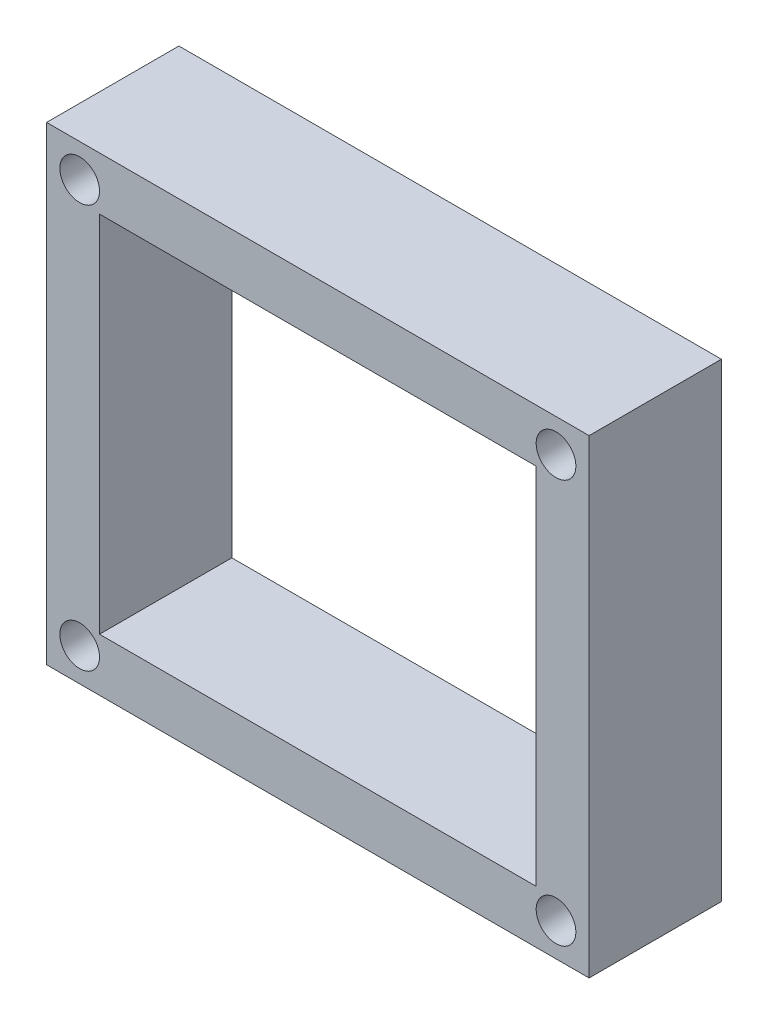
ISO-10303-21;
HEADER;
FILE_DESCRIPTION(('STEP AP214'),'2;1');
FILE_NAME('part.step','',(''),(''),'','','');
FILE_SCHEMA(('AUTOMOTIVE_DESIGN { 1 0 10303 214 1 1 1 1 }'));
ENDSEC;
DATA;
#1=APPLICATION_CONTEXT('core data for automotive mechanical design processes');
#2=APPLICATION_PROTOCOL_DEFINITION('international standard','automotive_design',2000,#1);
#3=PRODUCT_CONTEXT('',#1,'mechanical');
#4=PRODUCT('Part','Part','',(#3));
#5=PRODUCT_RELATED_PRODUCT_CATEGORY('part','',(#4));
#6=PRODUCT_DEFINITION_FORMATION('','',#4);
#7=PRODUCT_DEFINITION_CONTEXT('part definition',#1,'design');
#8=PRODUCT_DEFINITION('design','',#6,#7);
#9=PRODUCT_DEFINITION_SHAPE('','',#8);
#10=(LENGTH_UNIT() NAMED_UNIT(*) SI_UNIT(.MILLI.,.METRE.));
#11=(NAMED_UNIT(*) PLANE_ANGLE_UNIT() SI_UNIT($,.RADIAN.));
#12=(NAMED_UNIT(*) SI_UNIT($,.STERADIAN.) SOLID_ANGLE_UNIT());
#13=UNCERTAINTY_MEASURE_WITH_UNIT(LENGTH_MEASURE(1.E-05),#10,'distance_accuracy_value','');
#14=(GEOMETRIC_REPRESENTATION_CONTEXT(3) GLOBAL_UNCERTAINTY_ASSIGNED_CONTEXT((#13)) GLOBAL_UNIT_ASSIGNED_CONTEXT((#10,
#11,#12)) REPRESENTATION_CONTEXT('',''));
#15=CARTESIAN_POINT('',(0.,0.,0.));
#16=DIRECTION('',(0.,0.,1.));
#17=DIRECTION('',(1.,0.,0.));
#18=AXIS2_PLACEMENT_3D('',#15,#16,#17);
#19=CARTESIAN_POINT('',(0.,0.,0.));
#20=DIRECTION('',(0.,0.,1.));
#21=DIRECTION('',(1.,0.,0.));
#22=AXIS2_PLACEMENT_3D('',#19,#20,#21);
#23=PLANE('',#22);
#24=CARTESIAN_POINT('',(-36.,-30.5,0.));
#25=DIRECTION('',(0.,0.,1.));
#26=DIRECTION('',(1.,0.,0.));
#27=AXIS2_PLACEMENT_3D('',#24,#25,#26);
#28=CIRCLE('',#27,3.);
#29=CARTESIAN_POINT('',(-33.,-30.5,0.));
#30=VERTEX_POINT('',#29);
#31=EDGE_CURVE('E166',#30,#30,#28,.T.);
#32=ORIENTED_EDGE('',*,*,#31,.T.);
#33=EDGE_LOOP('',(#32));
#34=FACE_BOUND('',#33,.T.);
#35=CARTESIAN_POINT('',(-36.,30.5,0.));
#36=DIRECTION('',(0.,0.,1.));
#37=DIRECTION('',(1.,0.,0.));
#38=AXIS2_PLACEMENT_3D('',#35,#36,#37);
#39=CIRCLE('',#38,3.);
#40=CARTESIAN_POINT('',(-33.,30.5,0.));
#41=VERTEX_POINT('',#40);
#42=EDGE_CURVE('E169',#41,#41,#39,.T.);
#43=ORIENTED_EDGE('',*,*,#42,.T.);
#44=EDGE_LOOP('',(#43));
#45=FACE_BOUND('',#44,.T.);
#46=DIRECTION('',(1.,0.,0.));
#47=VECTOR('',#46,1.);
#48=CARTESIAN_POINT('',(0.,35.5,0.));
#49=LINE('',#48,#47);
#50=CARTESIAN_POINT('',(-41.,35.5,0.));
#51=VERTEX_POINT('',#50);
#52=CARTESIAN_POINT('',(41.,35.5,0.));
#53=VERTEX_POINT('',#52);
#54=EDGE_CURVE('E173',#51,#53,#49,.T.);
#55=ORIENTED_EDGE('',*,*,#54,.T.);
#56=DIRECTION('',(0.,-1.,0.));
#57=VECTOR('',#56,1.);
#58=CARTESIAN_POINT('',(41.,0.,0.));
#59=LINE('',#58,#57);
#60=CARTESIAN_POINT('',(41.,-35.5,0.));
#61=VERTEX_POINT('',#60);
#62=EDGE_CURVE('E182',#53,#61,#59,.T.);
#63=ORIENTED_EDGE('',*,*,#62,.T.);
#64=DIRECTION('',(1.,0.,0.));
#65=VECTOR('',#64,1.);
#66=CARTESIAN_POINT('',(0.,-35.5,0.));
#67=LINE('',#66,#65);
#68=CARTESIAN_POINT('',(-41.,-35.5,0.));
#69=VERTEX_POINT('',#68);
#70=EDGE_CURVE('E179',#69,#61,#67,.T.);
#71=ORIENTED_EDGE('',*,*,#70,.F.);
#72=DIRECTION('',(0.,-1.,0.));
#73=VECTOR('',#72,1.);
#74=CARTESIAN_POINT('',(-41.,0.,0.));
#75=LINE('',#74,#73);
#76=EDGE_CURVE('E176',#51,#69,#75,.T.);
#77=ORIENTED_EDGE('',*,*,#76,.F.);
#78=EDGE_LOOP('',(#55,#63,#71,#77));
#79=FACE_BOUND('',#78,.T.);
#80=DIRECTION('',(1.,0.,0.));
#81=VECTOR('',#80,1.);
#82=CARTESIAN_POINT('',(0.,27.5,0.));
#83=LINE('',#82,#81);
#84=CARTESIAN_POINT('',(-33.,27.5,0.));
#85=VERTEX_POINT('',#84);
#86=CARTESIAN_POINT('',(33.,27.5,0.));
#87=VERTEX_POINT('',#86);
#88=EDGE_CURVE('E185',#85,#87,#83,.T.);
#89=ORIENTED_EDGE('',*,*,#88,.F.);
#90=DIRECTION('',(0.,-1.,0.));
#91=VECTOR('',#90,1.);
#92=CARTESIAN_POINT('',(-33.,0.,0.));
#93=LINE('',#92,#91);
#94=CARTESIAN_POINT('',(-33.,-27.5,0.));
#95=VERTEX_POINT('',#94);
#96=EDGE_CURVE('E190',#85,#95,#93,.T.);
#97=ORIENTED_EDGE('',*,*,#96,.T.);
#98=DIRECTION('',(1.,0.,0.));
#99=VECTOR('',#98,1.);
#100=CARTESIAN_POINT('',(0.,-27.5,0.));
#101=LINE('',#100,#99);
#102=CARTESIAN_POINT('',(33.,-27.5,0.));
#103=VERTEX_POINT('',#102);
#104=EDGE_CURVE('E188',#95,#103,#101,.T.);
#105=ORIENTED_EDGE('',*,*,#104,.T.);
#106=DIRECTION('',(0.,-1.,0.));
#107=VECTOR('',#106,1.);
#108=CARTESIAN_POINT('',(33.,0.,0.));
#109=LINE('',#108,#107);
#110=EDGE_CURVE('E155',#87,#103,#109,.T.);
#111=ORIENTED_EDGE('',*,*,#110,.F.);
#112=EDGE_LOOP('',(#89,#97,#105,#111));
#113=FACE_BOUND('',#112,.T.);
#114=CARTESIAN_POINT('',(36.,-30.5,0.));
#115=DIRECTION('',(0.,0.,1.));
#116=DIRECTION('',(1.,0.,0.));
#117=AXIS2_PLACEMENT_3D('',#114,#115,#116);
#118=CIRCLE('',#117,3.);
#119=CARTESIAN_POINT('',(39.,-30.5,0.));
#120=VERTEX_POINT('',#119);
#121=EDGE_CURVE('E254',#120,#120,#118,.T.);
#122=ORIENTED_EDGE('',*,*,#121,.T.);
#123=EDGE_LOOP('',(#122));
#124=FACE_BOUND('',#123,.T.);
#125=CARTESIAN_POINT('',(36.,30.5,0.));
#126=DIRECTION('',(0.,0.,1.));
#127=DIRECTION('',(1.,0.,0.));
#128=AXIS2_PLACEMENT_3D('',#125,#126,#127);
#129=CIRCLE('',#128,3.);
#130=CARTESIAN_POINT('',(39.,30.5,0.));
#131=VERTEX_POINT('',#130);
#132=EDGE_CURVE('E257',#131,#131,#129,.T.);
#133=ORIENTED_EDGE('',*,*,#132,.T.);
#134=EDGE_LOOP('',(#133));
#135=FACE_BOUND('',#134,.T.);
#136=ADVANCED_FACE('F69',(#34,#45,#79,#113,#124,#135),#23,.F.);
#137=CARTESIAN_POINT('',(0.,0.,20.));
#138=DIRECTION('',(0.,0.,1.));
#139=DIRECTION('',(1.,0.,0.));
#140=AXIS2_PLACEMENT_3D('',#137,#138,#139);
#141=PLANE('',#140);
#142=CARTESIAN_POINT('',(36.,-30.5,20.));
#143=DIRECTION('',(0.,0.,1.));
#144=DIRECTION('',(1.,0.,0.));
#145=AXIS2_PLACEMENT_3D('',#142,#143,#144);
#146=CIRCLE('',#145,3.);
#147=CARTESIAN_POINT('',(39.,-30.5,20.));
#148=VERTEX_POINT('',#147);
#149=EDGE_CURVE('E170',#148,#148,#146,.T.);
#150=ORIENTED_EDGE('',*,*,#149,.F.);
#151=EDGE_LOOP('',(#150));
#152=FACE_BOUND('',#151,.T.);
#153=CARTESIAN_POINT('',(-36.,-30.5,20.));
#154=DIRECTION('',(0.,0.,1.));
#155=DIRECTION('',(1.,0.,0.));
#156=AXIS2_PLACEMENT_3D('',#153,#154,#155);
#157=CIRCLE('',#156,3.);
#158=CARTESIAN_POINT('',(-33.,-30.5,20.));
#159=VERTEX_POINT('',#158);
#160=EDGE_CURVE('E193',#159,#159,#157,.T.);
#161=ORIENTED_EDGE('',*,*,#160,.F.);
#162=EDGE_LOOP('',(#161));
#163=FACE_BOUND('',#162,.T.);
#164=CARTESIAN_POINT('',(-36.,30.5,20.));
#165=DIRECTION('',(0.,0.,1.));
#166=DIRECTION('',(1.,0.,0.));
#167=AXIS2_PLACEMENT_3D('',#164,#165,#166);
#168=CIRCLE('',#167,3.);
#169=CARTESIAN_POINT('',(-33.,30.5,20.));
#170=VERTEX_POINT('',#169);
#171=EDGE_CURVE('E267',#170,#170,#168,.T.);
#172=ORIENTED_EDGE('',*,*,#171,.F.);
#173=EDGE_LOOP('',(#172));
#174=FACE_BOUND('',#173,.T.);
#175=DIRECTION('',(1.,0.,0.));
#176=VECTOR('',#175,1.);
#177=CARTESIAN_POINT('',(0.,35.5,20.));
#178=LINE('',#177,#176);
#179=CARTESIAN_POINT('',(-41.,35.5,20.));
#180=VERTEX_POINT('',#179);
#181=CARTESIAN_POINT('',(41.,35.5,20.));
#182=VERTEX_POINT('',#181);
#183=EDGE_CURVE('E212',#180,#182,#178,.T.);
#184=ORIENTED_EDGE('',*,*,#183,.F.);
#185=DIRECTION('',(0.,-1.,0.));
#186=VECTOR('',#185,1.);
#187=CARTESIAN_POINT('',(-41.,0.,20.));
#188=LINE('',#187,#186);
#189=CARTESIAN_POINT('',(-41.,-35.5,20.));
#190=VERTEX_POINT('',#189);
#191=EDGE_CURVE('E206',#180,#190,#188,.T.);
#192=ORIENTED_EDGE('',*,*,#191,.T.);
#193=DIRECTION('',(1.,0.,0.));
#194=VECTOR('',#193,1.);
#195=CARTESIAN_POINT('',(0.,-35.5,20.));
#196=LINE('',#195,#194);
#197=CARTESIAN_POINT('',(41.,-35.5,20.));
#198=VERTEX_POINT('',#197);
#199=EDGE_CURVE('E272',#190,#198,#196,.T.);
#200=ORIENTED_EDGE('',*,*,#199,.T.);
#201=DIRECTION('',(0.,-1.,0.));
#202=VECTOR('',#201,1.);
#203=CARTESIAN_POINT('',(41.,0.,20.));
#204=LINE('',#203,#202);
#205=EDGE_CURVE('E217',#182,#198,#204,.T.);
#206=ORIENTED_EDGE('',*,*,#205,.F.);
#207=EDGE_LOOP('',(#184,#192,#200,#206));
#208=FACE_BOUND('',#207,.T.);
#209=DIRECTION('',(1.,0.,0.));
#210=VECTOR('',#209,1.);
#211=CARTESIAN_POINT('',(0.,27.5,20.));
#212=LINE('',#211,#210);
#213=CARTESIAN_POINT('',(-33.,27.5,20.));
#214=VERTEX_POINT('',#213);
#215=CARTESIAN_POINT('',(33.,27.5,20.));
#216=VERTEX_POINT('',#215);
#217=EDGE_CURVE('E149',#214,#216,#212,.T.);
#218=ORIENTED_EDGE('',*,*,#217,.T.);
#219=DIRECTION('',(0.,-1.,0.));
#220=VECTOR('',#219,1.);
#221=CARTESIAN_POINT('',(33.,0.,20.));
#222=LINE('',#221,#220);
#223=CARTESIAN_POINT('',(33.,-27.5,20.));
#224=VERTEX_POINT('',#223);
#225=EDGE_CURVE('E142',#216,#224,#222,.T.);
#226=ORIENTED_EDGE('',*,*,#225,.T.);
#227=DIRECTION('',(1.,0.,0.));
#228=VECTOR('',#227,1.);
#229=CARTESIAN_POINT('',(0.,-27.5,20.));
#230=LINE('',#229,#228);
#231=CARTESIAN_POINT('',(-33.,-27.5,20.));
#232=VERTEX_POINT('',#231);
#233=EDGE_CURVE('E148',#232,#224,#230,.T.);
#234=ORIENTED_EDGE('',*,*,#233,.F.);
#235=DIRECTION('',(0.,-1.,0.));
#236=VECTOR('',#235,1.);
#237=CARTESIAN_POINT('',(-33.,0.,20.));
#238=LINE('',#237,#236);
#239=EDGE_CURVE('E160',#214,#232,#238,.T.);
#240=ORIENTED_EDGE('',*,*,#239,.F.);
#241=EDGE_LOOP('',(#218,#226,#234,#240));
#242=FACE_BOUND('',#241,.T.);
#243=CARTESIAN_POINT('',(36.,30.5,20.));
#244=DIRECTION('',(0.,0.,1.));
#245=DIRECTION('',(1.,0.,0.));
#246=AXIS2_PLACEMENT_3D('',#243,#244,#245);
#247=CIRCLE('',#246,3.);
#248=CARTESIAN_POINT('',(39.,30.5,20.));
#249=VERTEX_POINT('',#248);
#250=EDGE_CURVE('E259',#249,#249,#247,.T.);
#251=ORIENTED_EDGE('',*,*,#250,.F.);
#252=EDGE_LOOP('',(#251));
#253=FACE_BOUND('',#252,.T.);
#254=ADVANCED_FACE('F144',(#152,#163,#174,#208,#242,#253),#141,.T.);
#255=CARTESIAN_POINT('',(33.,0.,20.));
#256=DIRECTION('',(1.,0.,0.));
#257=DIRECTION('',(0.,1.,0.));
#258=AXIS2_PLACEMENT_3D('',#255,#256,#257);
#259=PLANE('',#258);
#260=ORIENTED_EDGE('',*,*,#110,.T.);
#261=DIRECTION('',(0.,0.,-1.));
#262=VECTOR('',#261,1.);
#263=CARTESIAN_POINT('',(33.,-27.5,20.));
#264=LINE('',#263,#262);
#265=EDGE_CURVE('E79',#224,#103,#264,.T.);
#266=ORIENTED_EDGE('',*,*,#265,.F.);
#267=ORIENTED_EDGE('',*,*,#225,.F.);
#268=DIRECTION('',(0.,0.,-1.));
#269=VECTOR('',#268,1.);
#270=CARTESIAN_POINT('',(33.,27.5,20.));
#271=LINE('',#270,#269);
#272=EDGE_CURVE('E12',#216,#87,#271,.T.);
#273=ORIENTED_EDGE('',*,*,#272,.T.);
#274=EDGE_LOOP('',(#260,#266,#267,#273));
#275=FACE_BOUND('',#274,.T.);
#276=ADVANCED_FACE('F154',(#275),#259,.F.);
#277=CARTESIAN_POINT('',(0.,-27.5,20.));
#278=DIRECTION('',(0.,1.,0.));
#279=DIRECTION('',(0.,0.,1.));
#280=AXIS2_PLACEMENT_3D('',#277,#278,#279);
#281=PLANE('',#280);
#282=ORIENTED_EDGE('',*,*,#104,.F.);
#283=DIRECTION('',(0.,0.,-1.));
#284=VECTOR('',#283,1.);
#285=CARTESIAN_POINT('',(-33.,-27.5,20.));
#286=LINE('',#285,#284);
#287=EDGE_CURVE('E114',#232,#95,#286,.T.);
#288=ORIENTED_EDGE('',*,*,#287,.F.);
#289=ORIENTED_EDGE('',*,*,#233,.T.);
#290=ORIENTED_EDGE('',*,*,#265,.T.);
#291=EDGE_LOOP('',(#282,#288,#289,#290));
#292=FACE_BOUND('',#291,.T.);
#293=ADVANCED_FACE('F159',(#292),#281,.T.);
#294=CARTESIAN_POINT('',(-33.,0.,20.));
#295=DIRECTION('',(1.,0.,0.));
#296=DIRECTION('',(0.,1.,0.));
#297=AXIS2_PLACEMENT_3D('',#294,#295,#296);
#298=PLANE('',#297);
#299=ORIENTED_EDGE('',*,*,#96,.F.);
#300=DIRECTION('',(0.,0.,-1.));
#301=VECTOR('',#300,1.);
#302=CARTESIAN_POINT('',(-33.,27.5,20.));
#303=LINE('',#302,#301);
#304=EDGE_CURVE('E88',#214,#85,#303,.T.);
#305=ORIENTED_EDGE('',*,*,#304,.F.);
#306=ORIENTED_EDGE('',*,*,#239,.T.);
#307=ORIENTED_EDGE('',*,*,#287,.T.);
#308=EDGE_LOOP('',(#299,#305,#306,#307));
#309=FACE_BOUND('',#308,.T.);
#310=ADVANCED_FACE('F240',(#309),#298,.T.);
#311=CARTESIAN_POINT('',(0.,27.5,20.));
#312=DIRECTION('',(0.,1.,0.));
#313=DIRECTION('',(0.,0.,1.));
#314=AXIS2_PLACEMENT_3D('',#311,#312,#313);
#315=PLANE('',#314);
#316=ORIENTED_EDGE('',*,*,#88,.T.);
#317=ORIENTED_EDGE('',*,*,#272,.F.);
#318=ORIENTED_EDGE('',*,*,#217,.F.);
#319=ORIENTED_EDGE('',*,*,#304,.T.);
#320=EDGE_LOOP('',(#316,#317,#318,#319));
#321=FACE_BOUND('',#320,.T.);
#322=ADVANCED_FACE('F227',(#321),#315,.F.);
#323=CARTESIAN_POINT('',(-41.,0.,20.));
#324=DIRECTION('',(1.,0.,0.));
#325=DIRECTION('',(0.,0.,-1.));
#326=AXIS2_PLACEMENT_3D('',#323,#324,#325);
#327=PLANE('',#326);
#328=ORIENTED_EDGE('',*,*,#76,.T.);
#329=DIRECTION('',(0.,0.,-1.));
#330=VECTOR('',#329,1.);
#331=CARTESIAN_POINT('',(-41.,-35.5,20.));
#332=LINE('',#331,#330);
#333=EDGE_CURVE('E198',#190,#69,#332,.T.);
#334=ORIENTED_EDGE('',*,*,#333,.F.);
#335=ORIENTED_EDGE('',*,*,#191,.F.);
#336=DIRECTION('',(0.,0.,-1.));
#337=VECTOR('',#336,1.);
#338=CARTESIAN_POINT('',(-41.,35.5,20.));
#339=LINE('',#338,#337);
#340=EDGE_CURVE('E73',#180,#51,#339,.T.);
#341=ORIENTED_EDGE('',*,*,#340,.T.);
#342=EDGE_LOOP('',(#328,#334,#335,#341));
#343=FACE_BOUND('',#342,.T.);
#344=ADVANCED_FACE('F204',(#343),#327,.F.);
#345=CARTESIAN_POINT('',(0.,-35.5,20.));
#346=DIRECTION('',(0.,1.,0.));
#347=DIRECTION('',(0.,0.,1.));
#348=AXIS2_PLACEMENT_3D('',#345,#346,#347);
#349=PLANE('',#348);
#350=ORIENTED_EDGE('',*,*,#70,.T.);
#351=DIRECTION('',(0.,0.,-1.));
#352=VECTOR('',#351,1.);
#353=CARTESIAN_POINT('',(41.,-35.5,20.));
#354=LINE('',#353,#352);
#355=EDGE_CURVE('E197',#198,#61,#354,.T.);
#356=ORIENTED_EDGE('',*,*,#355,.F.);
#357=ORIENTED_EDGE('',*,*,#199,.F.);
#358=ORIENTED_EDGE('',*,*,#333,.T.);
#359=EDGE_LOOP('',(#350,#356,#357,#358));
#360=FACE_BOUND('',#359,.T.);
#361=ADVANCED_FACE('F219',(#360),#349,.F.);
#362=CARTESIAN_POINT('',(41.,0.,20.));
#363=DIRECTION('',(1.,0.,0.));
#364=DIRECTION('',(0.,1.,0.));
#365=AXIS2_PLACEMENT_3D('',#362,#363,#364);
#366=PLANE('',#365);
#367=ORIENTED_EDGE('',*,*,#62,.F.);
#368=DIRECTION('',(0.,0.,-1.));
#369=VECTOR('',#368,1.);
#370=CARTESIAN_POINT('',(41.,35.5,20.));
#371=LINE('',#370,#369);
#372=EDGE_CURVE('E162',#182,#53,#371,.T.);
#373=ORIENTED_EDGE('',*,*,#372,.F.);
#374=ORIENTED_EDGE('',*,*,#205,.T.);
#375=ORIENTED_EDGE('',*,*,#355,.T.);
#376=EDGE_LOOP('',(#367,#373,#374,#375));
#377=FACE_BOUND('',#376,.T.);
#378=ADVANCED_FACE('F216',(#377),#366,.T.);
#379=CARTESIAN_POINT('',(0.,35.5,20.));
#380=DIRECTION('',(0.,1.,0.));
#381=DIRECTION('',(0.,0.,1.));
#382=AXIS2_PLACEMENT_3D('',#379,#380,#381);
#383=PLANE('',#382);
#384=ORIENTED_EDGE('',*,*,#54,.F.);
#385=ORIENTED_EDGE('',*,*,#340,.F.);
#386=ORIENTED_EDGE('',*,*,#183,.T.);
#387=ORIENTED_EDGE('',*,*,#372,.T.);
#388=EDGE_LOOP('',(#384,#385,#386,#387));
#389=FACE_BOUND('',#388,.T.);
#390=ADVANCED_FACE('F211',(#389),#383,.T.);
#391=CARTESIAN_POINT('',(-36.,30.5,20.));
#392=DIRECTION('',(0.,0.,-1.));
#393=DIRECTION('',(-1.,0.,0.));
#394=AXIS2_PLACEMENT_3D('',#391,#392,#393);
#395=CYLINDRICAL_SURFACE('',#394,3.);
#396=ORIENTED_EDGE('',*,*,#171,.T.);
#397=EDGE_LOOP('',(#396));
#398=FACE_BOUND('',#397,.T.);
#399=ORIENTED_EDGE('',*,*,#42,.F.);
#400=EDGE_LOOP('',(#399));
#401=FACE_BOUND('',#400,.T.);
#402=ADVANCED_FACE('F277',(#398,#401),#395,.F.);
#403=CARTESIAN_POINT('',(-36.,-30.5,20.));
#404=DIRECTION('',(0.,0.,-1.));
#405=DIRECTION('',(-1.,0.,0.));
#406=AXIS2_PLACEMENT_3D('',#403,#404,#405);
#407=CYLINDRICAL_SURFACE('',#406,3.);
#408=ORIENTED_EDGE('',*,*,#160,.T.);
#409=EDGE_LOOP('',(#408));
#410=FACE_BOUND('',#409,.T.);
#411=ORIENTED_EDGE('',*,*,#31,.F.);
#412=EDGE_LOOP('',(#411));
#413=FACE_BOUND('',#412,.T.);
#414=ADVANCED_FACE('F71',(#410,#413),#407,.F.);
#415=CARTESIAN_POINT('',(36.,-30.5,20.));
#416=DIRECTION('',(0.,0.,-1.));
#417=DIRECTION('',(-1.,0.,0.));
#418=AXIS2_PLACEMENT_3D('',#415,#416,#417);
#419=CYLINDRICAL_SURFACE('',#418,3.);
#420=ORIENTED_EDGE('',*,*,#149,.T.);
#421=EDGE_LOOP('',(#420));
#422=FACE_BOUND('',#421,.T.);
#423=ORIENTED_EDGE('',*,*,#121,.F.);
#424=EDGE_LOOP('',(#423));
#425=FACE_BOUND('',#424,.T.);
#426=ADVANCED_FACE('F286',(#422,#425),#419,.F.);
#427=CARTESIAN_POINT('',(36.,30.5,20.));
#428=DIRECTION('',(0.,0.,-1.));
#429=DIRECTION('',(-1.,0.,0.));
#430=AXIS2_PLACEMENT_3D('',#427,#428,#429);
#431=CYLINDRICAL_SURFACE('',#430,3.);
#432=ORIENTED_EDGE('',*,*,#250,.T.);
#433=EDGE_LOOP('',(#432));
#434=FACE_BOUND('',#433,.T.);
#435=ORIENTED_EDGE('',*,*,#132,.F.);
#436=EDGE_LOOP('',(#435));
#437=FACE_BOUND('',#436,.T.);
#438=ADVANCED_FACE('F346',(#434,#437),#431,.F.);
#439=CLOSED_SHELL('',(#136,#254,#276,#293,#310,#322,#344,#361,#378,#390,#402,#414,#426,#438));
#440=MANIFOLD_SOLID_BREP('B2',#439);
#441=ADVANCED_BREP_SHAPE_REPRESENTATION('',(#18,#440),#14);
#442=SHAPE_DEFINITION_REPRESENTATION(#9,#441);
ENDSEC;
END-ISO-10303-21;
